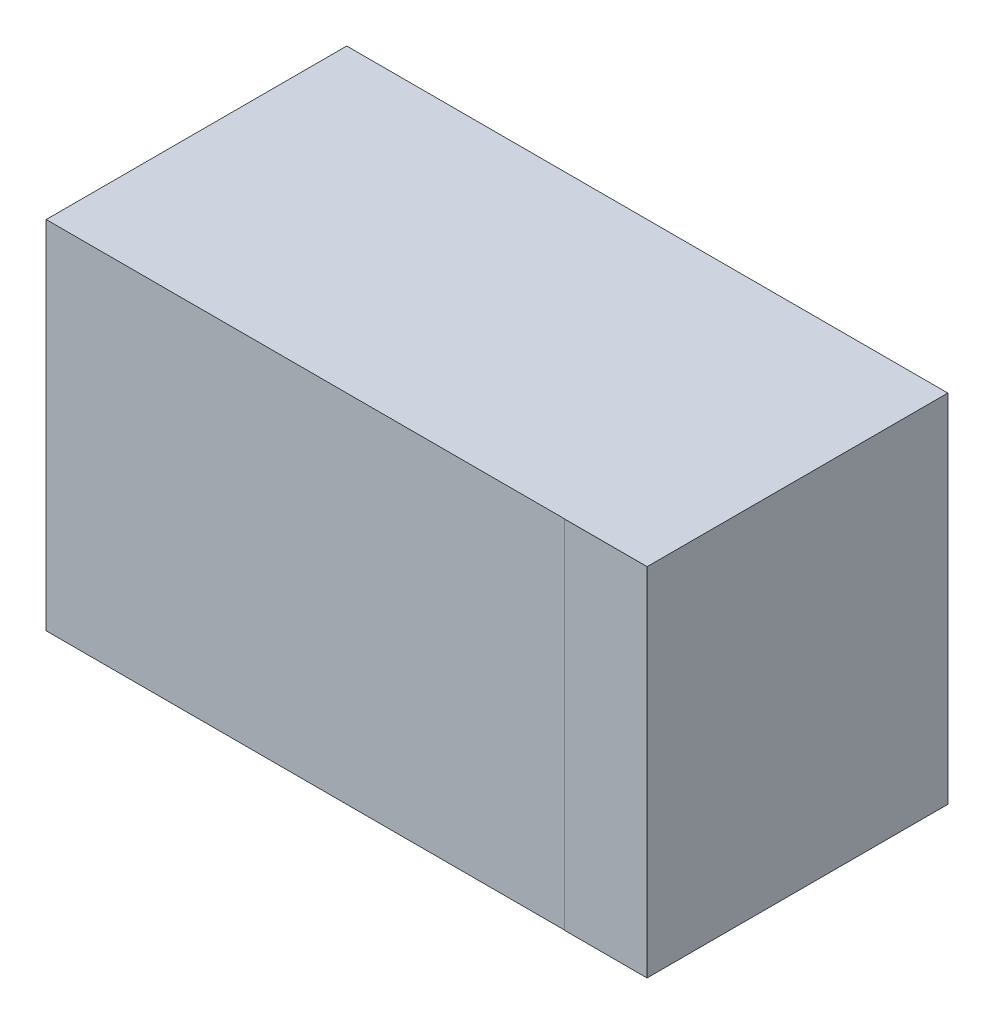
ISO-10303-21;
HEADER;
FILE_DESCRIPTION(('STEP AP214'),'2;1');
FILE_NAME('part.step','',(''),(''),'','','');
FILE_SCHEMA(('AUTOMOTIVE_DESIGN { 1 0 10303 214 1 1 1 1 }'));
ENDSEC;
DATA;
#1=APPLICATION_CONTEXT('core data for automotive mechanical design processes');
#2=APPLICATION_PROTOCOL_DEFINITION('international standard','automotive_design',2000,#1);
#3=PRODUCT_CONTEXT('',#1,'mechanical');
#4=PRODUCT('Part','Part','',(#3));
#5=PRODUCT_RELATED_PRODUCT_CATEGORY('part','',(#4));
#6=PRODUCT_DEFINITION_FORMATION('','',#4);
#7=PRODUCT_DEFINITION_CONTEXT('part definition',#1,'design');
#8=PRODUCT_DEFINITION('design','',#6,#7);
#9=PRODUCT_DEFINITION_SHAPE('','',#8);
#10=(LENGTH_UNIT() NAMED_UNIT(*) SI_UNIT(.MILLI.,.METRE.));
#11=(NAMED_UNIT(*) PLANE_ANGLE_UNIT() SI_UNIT($,.RADIAN.));
#12=(NAMED_UNIT(*) SI_UNIT($,.STERADIAN.) SOLID_ANGLE_UNIT());
#13=UNCERTAINTY_MEASURE_WITH_UNIT(LENGTH_MEASURE(1.E-05),#10,'distance_accuracy_value','');
#14=(GEOMETRIC_REPRESENTATION_CONTEXT(3) GLOBAL_UNCERTAINTY_ASSIGNED_CONTEXT((#13)) GLOBAL_UNIT_ASSIGNED_CONTEXT((#10,
#11,#12)) REPRESENTATION_CONTEXT('',''));
#15=CARTESIAN_POINT('',(0.,0.,0.));
#16=DIRECTION('',(0.,0.,1.));
#17=DIRECTION('',(1.,0.,0.));
#18=AXIS2_PLACEMENT_3D('',#15,#16,#17);
#19=CARTESIAN_POINT('',(-1.34999984,0.80000094,0.));
#20=DIRECTION('',(1.,0.,0.));
#21=DIRECTION('',(0.,-1.,0.));
#22=AXIS2_PLACEMENT_3D('',#19,#20,#21);
#23=PLANE('',#22);
#24=DIRECTION('',(0.,-1.,0.));
#25=VECTOR('',#24,1.);
#26=CARTESIAN_POINT('',(-1.34999984,0.80000094,0.));
#27=LINE('',#26,#25);
#28=CARTESIAN_POINT('',(-1.34999984,0.80000094,0.));
#29=VERTEX_POINT('',#28);
#30=CARTESIAN_POINT('',(-1.34999984,-0.80000094,0.));
#31=VERTEX_POINT('',#30);
#32=EDGE_CURVE('P0_E11',#29,#31,#27,.T.);
#33=ORIENTED_EDGE('',*,*,#32,.T.);
#34=DIRECTION('',(0.,0.,1.));
#35=VECTOR('',#34,1.);
#36=CARTESIAN_POINT('',(-1.34999984,-0.80000094,0.));
#37=LINE('',#36,#35);
#38=CARTESIAN_POINT('',(-1.34999984,-0.80000094,1.34999984));
#39=VERTEX_POINT('',#38);
#40=EDGE_CURVE('P0_E24',#31,#39,#37,.T.);
#41=ORIENTED_EDGE('',*,*,#40,.T.);
#42=DIRECTION('',(0.,-1.,0.));
#43=VECTOR('',#42,1.);
#44=CARTESIAN_POINT('',(-1.34999984,0.80000094,1.34999984));
#45=LINE('',#44,#43);
#46=CARTESIAN_POINT('',(-1.34999984,0.80000094,1.34999984));
#47=VERTEX_POINT('',#46);
#48=EDGE_CURVE('P0_E87',#47,#39,#45,.T.);
#49=ORIENTED_EDGE('',*,*,#48,.F.);
#50=DIRECTION('',(0.,0.,1.));
#51=VECTOR('',#50,1.);
#52=CARTESIAN_POINT('',(-1.34999984,0.80000094,0.));
#53=LINE('',#52,#51);
#54=EDGE_CURVE('P0_E36',#29,#47,#53,.T.);
#55=ORIENTED_EDGE('',*,*,#54,.F.);
#56=EDGE_LOOP('',(#33,#41,#49,#55));
#57=FACE_BOUND('',#56,.T.);
#58=ADVANCED_FACE('P0_F17',(#57),#23,.F.);
#59=CARTESIAN_POINT('',(-1.34999984,-0.80000094,0.));
#60=DIRECTION('',(0.,1.,0.));
#61=DIRECTION('',(1.,0.,0.));
#62=AXIS2_PLACEMENT_3D('',#59,#60,#61);
#63=PLANE('',#62);
#64=DIRECTION('',(1.,0.,0.));
#65=VECTOR('',#64,1.);
#66=CARTESIAN_POINT('',(-1.34999984,-0.80000094,0.));
#67=LINE('',#66,#65);
#68=CARTESIAN_POINT('',(1.34999984,-0.80000094,0.));
#69=VERTEX_POINT('',#68);
#70=EDGE_CURVE('P0_E84',#31,#69,#67,.T.);
#71=ORIENTED_EDGE('',*,*,#70,.T.);
#72=DIRECTION('',(0.,0.,1.));
#73=VECTOR('',#72,1.);
#74=CARTESIAN_POINT('',(1.34999984,-0.80000094,0.));
#75=LINE('',#74,#73);
#76=CARTESIAN_POINT('',(1.34999984,-0.80000094,1.34999984));
#77=VERTEX_POINT('',#76);
#78=EDGE_CURVE('P0_E82',#69,#77,#75,.T.);
#79=ORIENTED_EDGE('',*,*,#78,.T.);
#80=DIRECTION('',(1.,0.,0.));
#81=VECTOR('',#80,1.);
#82=CARTESIAN_POINT('',(-1.34999984,-0.80000094,1.34999984));
#83=LINE('',#82,#81);
#84=EDGE_CURVE('P0_E62',#39,#77,#83,.T.);
#85=ORIENTED_EDGE('',*,*,#84,.F.);
#86=ORIENTED_EDGE('',*,*,#40,.F.);
#87=EDGE_LOOP('',(#71,#79,#85,#86));
#88=FACE_BOUND('',#87,.T.);
#89=ADVANCED_FACE('P0_F89',(#88),#63,.F.);
#90=CARTESIAN_POINT('',(1.34999984,-0.80000094,0.));
#91=DIRECTION('',(-1.,0.,0.));
#92=DIRECTION('',(0.,1.,0.));
#93=AXIS2_PLACEMENT_3D('',#90,#91,#92);
#94=PLANE('',#93);
#95=DIRECTION('',(0.,1.,0.));
#96=VECTOR('',#95,1.);
#97=CARTESIAN_POINT('',(1.34999984,-0.80000094,0.));
#98=LINE('',#97,#96);
#99=CARTESIAN_POINT('',(1.34999984,0.80000094,0.));
#100=VERTEX_POINT('',#99);
#101=EDGE_CURVE('P0_E71',#69,#100,#98,.T.);
#102=ORIENTED_EDGE('',*,*,#101,.T.);
#103=DIRECTION('',(0.,0.,1.));
#104=VECTOR('',#103,1.);
#105=CARTESIAN_POINT('',(1.34999984,0.80000094,0.));
#106=LINE('',#105,#104);
#107=CARTESIAN_POINT('',(1.34999984,0.80000094,1.34999984));
#108=VERTEX_POINT('',#107);
#109=EDGE_CURVE('P0_E65',#100,#108,#106,.T.);
#110=ORIENTED_EDGE('',*,*,#109,.T.);
#111=DIRECTION('',(0.,1.,0.));
#112=VECTOR('',#111,1.);
#113=CARTESIAN_POINT('',(1.34999984,-0.80000094,1.34999984));
#114=LINE('',#113,#112);
#115=EDGE_CURVE('P0_E57',#77,#108,#114,.T.);
#116=ORIENTED_EDGE('',*,*,#115,.F.);
#117=ORIENTED_EDGE('',*,*,#78,.F.);
#118=EDGE_LOOP('',(#102,#110,#116,#117));
#119=FACE_BOUND('',#118,.T.);
#120=ADVANCED_FACE('P0_F69',(#119),#94,.F.);
#121=CARTESIAN_POINT('',(1.34999984,0.80000094,0.));
#122=DIRECTION('',(0.,-1.,0.));
#123=DIRECTION('',(-1.,0.,0.));
#124=AXIS2_PLACEMENT_3D('',#121,#122,#123);
#125=PLANE('',#124);
#126=DIRECTION('',(-1.,0.,0.));
#127=VECTOR('',#126,1.);
#128=CARTESIAN_POINT('',(1.34999984,0.80000094,0.));
#129=LINE('',#128,#127);
#130=EDGE_CURVE('P0_E66',#100,#29,#129,.T.);
#131=ORIENTED_EDGE('',*,*,#130,.T.);
#132=ORIENTED_EDGE('',*,*,#54,.T.);
#133=DIRECTION('',(-1.,0.,0.));
#134=VECTOR('',#133,1.);
#135=CARTESIAN_POINT('',(1.34999984,0.80000094,1.34999984));
#136=LINE('',#135,#134);
#137=EDGE_CURVE('P0_E61',#108,#47,#136,.T.);
#138=ORIENTED_EDGE('',*,*,#137,.F.);
#139=ORIENTED_EDGE('',*,*,#109,.F.);
#140=EDGE_LOOP('',(#131,#132,#138,#139));
#141=FACE_BOUND('',#140,.T.);
#142=ADVANCED_FACE('P0_F76',(#141),#125,.F.);
#143=CARTESIAN_POINT('',(0.,0.,0.));
#144=DIRECTION('',(0.,0.,1.));
#145=DIRECTION('',(0.,-1.,0.));
#146=AXIS2_PLACEMENT_3D('',#143,#144,#145);
#147=PLANE('',#146);
#148=ORIENTED_EDGE('',*,*,#130,.F.);
#149=ORIENTED_EDGE('',*,*,#101,.F.);
#150=ORIENTED_EDGE('',*,*,#70,.F.);
#151=ORIENTED_EDGE('',*,*,#32,.F.);
#152=EDGE_LOOP('',(#148,#149,#150,#151));
#153=FACE_BOUND('',#152,.T.);
#154=ADVANCED_FACE('P0_F91',(#153),#147,.F.);
#155=CARTESIAN_POINT('',(0.,0.,1.34999984));
#156=DIRECTION('',(0.,0.,1.));
#157=DIRECTION('',(0.,-1.,0.));
#158=AXIS2_PLACEMENT_3D('',#155,#156,#157);
#159=PLANE('',#158);
#160=ORIENTED_EDGE('',*,*,#48,.T.);
#161=ORIENTED_EDGE('',*,*,#84,.T.);
#162=ORIENTED_EDGE('',*,*,#115,.T.);
#163=ORIENTED_EDGE('',*,*,#137,.T.);
#164=EDGE_LOOP('',(#160,#161,#162,#163));
#165=FACE_BOUND('',#164,.T.);
#166=ADVANCED_FACE('P0_F59',(#165),#159,.T.);
#167=CLOSED_SHELL('',(#58,#89,#120,#142,#154,#166));
#168=MANIFOLD_SOLID_BREP('P0_B1',#167);
#169=CARTESIAN_POINT('',(1.34999984,-0.80000094,1.34999984));
#170=DIRECTION('',(-1.,0.,0.));
#171=DIRECTION('',(0.,1.,0.));
#172=AXIS2_PLACEMENT_3D('',#169,#170,#171);
#173=PLANE('',#172);
#174=DIRECTION('',(0.,1.,0.));
#175=VECTOR('',#174,1.);
#176=CARTESIAN_POINT('',(1.34999984,-0.80000094,1.34999984));
#177=LINE('',#176,#175);
#178=CARTESIAN_POINT('',(1.34999984,-0.80000094,1.34999984));
#179=VERTEX_POINT('',#178);
#180=CARTESIAN_POINT('',(1.34999984,0.80000094,1.34999984));
#181=VERTEX_POINT('',#180);
#182=EDGE_CURVE('P1_E10',#179,#181,#177,.T.);
#183=ORIENTED_EDGE('',*,*,#182,.T.);
#184=DIRECTION('',(0.,0.,1.));
#185=VECTOR('',#184,1.);
#186=CARTESIAN_POINT('',(1.34999984,0.80000094,1.34999984));
#187=LINE('',#186,#185);
#188=CARTESIAN_POINT('',(1.34999984,0.80000094,1.3510006));
#189=VERTEX_POINT('',#188);
#190=EDGE_CURVE('P1_E23',#181,#189,#187,.T.);
#191=ORIENTED_EDGE('',*,*,#190,.T.);
#192=DIRECTION('',(0.,1.,0.));
#193=VECTOR('',#192,1.);
#194=CARTESIAN_POINT('',(1.34999984,-0.80000094,1.3510006));
#195=LINE('',#194,#193);
#196=CARTESIAN_POINT('',(1.34999984,-0.80000094,1.3510006));
#197=VERTEX_POINT('',#196);
#198=EDGE_CURVE('P1_E86',#197,#189,#195,.T.);
#199=ORIENTED_EDGE('',*,*,#198,.F.);
#200=DIRECTION('',(0.,0.,1.));
#201=VECTOR('',#200,1.);
#202=CARTESIAN_POINT('',(1.34999984,-0.80000094,1.34999984));
#203=LINE('',#202,#201);
#204=EDGE_CURVE('P1_E35',#179,#197,#203,.T.);
#205=ORIENTED_EDGE('',*,*,#204,.F.);
#206=EDGE_LOOP('',(#183,#191,#199,#205));
#207=FACE_BOUND('',#206,.T.);
#208=ADVANCED_FACE('P1_F16',(#207),#173,.F.);
#209=CARTESIAN_POINT('',(1.34999984,0.80000094,1.34999984));
#210=DIRECTION('',(0.,-1.,0.));
#211=DIRECTION('',(-1.,0.,0.));
#212=AXIS2_PLACEMENT_3D('',#209,#210,#211);
#213=PLANE('',#212);
#214=DIRECTION('',(-1.,0.,0.));
#215=VECTOR('',#214,1.);
#216=CARTESIAN_POINT('',(1.34999984,0.80000094,1.34999984));
#217=LINE('',#216,#215);
#218=CARTESIAN_POINT('',(0.98000058,0.80000094,1.34999984));
#219=VERTEX_POINT('',#218);
#220=EDGE_CURVE('P1_E83',#181,#219,#217,.T.);
#221=ORIENTED_EDGE('',*,*,#220,.T.);
#222=DIRECTION('',(0.,0.,1.));
#223=VECTOR('',#222,1.);
#224=CARTESIAN_POINT('',(0.98000058,0.80000094,1.34999984));
#225=LINE('',#224,#223);
#226=CARTESIAN_POINT('',(0.98000058,0.80000094,1.3510006));
#227=VERTEX_POINT('',#226);
#228=EDGE_CURVE('P1_E81',#219,#227,#225,.T.);
#229=ORIENTED_EDGE('',*,*,#228,.T.);
#230=DIRECTION('',(-1.,0.,0.));
#231=VECTOR('',#230,1.);
#232=CARTESIAN_POINT('',(1.34999984,0.80000094,1.3510006));
#233=LINE('',#232,#231);
#234=EDGE_CURVE('P1_E61',#189,#227,#233,.T.);
#235=ORIENTED_EDGE('',*,*,#234,.F.);
#236=ORIENTED_EDGE('',*,*,#190,.F.);
#237=EDGE_LOOP('',(#221,#229,#235,#236));
#238=FACE_BOUND('',#237,.T.);
#239=ADVANCED_FACE('P1_F88',(#238),#213,.F.);
#240=CARTESIAN_POINT('',(0.98000058,0.80000094,1.34999984));
#241=DIRECTION('',(1.,0.,0.));
#242=DIRECTION('',(0.,-1.,0.));
#243=AXIS2_PLACEMENT_3D('',#240,#241,#242);
#244=PLANE('',#243);
#245=DIRECTION('',(0.,-1.,0.));
#246=VECTOR('',#245,1.);
#247=CARTESIAN_POINT('',(0.98000058,0.80000094,1.34999984));
#248=LINE('',#247,#246);
#249=CARTESIAN_POINT('',(0.98000058,-0.80000094,1.34999984));
#250=VERTEX_POINT('',#249);
#251=EDGE_CURVE('P1_E70',#219,#250,#248,.T.);
#252=ORIENTED_EDGE('',*,*,#251,.T.);
#253=DIRECTION('',(0.,0.,1.));
#254=VECTOR('',#253,1.);
#255=CARTESIAN_POINT('',(0.98000058,-0.80000094,1.34999984));
#256=LINE('',#255,#254);
#257=CARTESIAN_POINT('',(0.98000058,-0.80000094,1.3510006));
#258=VERTEX_POINT('',#257);
#259=EDGE_CURVE('P1_E64',#250,#258,#256,.T.);
#260=ORIENTED_EDGE('',*,*,#259,.T.);
#261=DIRECTION('',(0.,-1.,0.));
#262=VECTOR('',#261,1.);
#263=CARTESIAN_POINT('',(0.98000058,0.80000094,1.3510006));
#264=LINE('',#263,#262);
#265=EDGE_CURVE('P1_E56',#227,#258,#264,.T.);
#266=ORIENTED_EDGE('',*,*,#265,.F.);
#267=ORIENTED_EDGE('',*,*,#228,.F.);
#268=EDGE_LOOP('',(#252,#260,#266,#267));
#269=FACE_BOUND('',#268,.T.);
#270=ADVANCED_FACE('P1_F68',(#269),#244,.F.);
#271=CARTESIAN_POINT('',(0.98000058,-0.80000094,1.34999984));
#272=DIRECTION('',(0.,1.,0.));
#273=DIRECTION('',(1.,0.,0.));
#274=AXIS2_PLACEMENT_3D('',#271,#272,#273);
#275=PLANE('',#274);
#276=DIRECTION('',(1.,0.,0.));
#277=VECTOR('',#276,1.);
#278=CARTESIAN_POINT('',(0.98000058,-0.80000094,1.34999984));
#279=LINE('',#278,#277);
#280=EDGE_CURVE('P1_E65',#250,#179,#279,.T.);
#281=ORIENTED_EDGE('',*,*,#280,.T.);
#282=ORIENTED_EDGE('',*,*,#204,.T.);
#283=DIRECTION('',(1.,0.,0.));
#284=VECTOR('',#283,1.);
#285=CARTESIAN_POINT('',(0.98000058,-0.80000094,1.3510006));
#286=LINE('',#285,#284);
#287=EDGE_CURVE('P1_E60',#258,#197,#286,.T.);
#288=ORIENTED_EDGE('',*,*,#287,.F.);
#289=ORIENTED_EDGE('',*,*,#259,.F.);
#290=EDGE_LOOP('',(#281,#282,#288,#289));
#291=FACE_BOUND('',#290,.T.);
#292=ADVANCED_FACE('P1_F75',(#291),#275,.F.);
#293=CARTESIAN_POINT('',(1.16500021,0.,1.34999984));
#294=DIRECTION('',(0.,0.,1.));
#295=DIRECTION('',(0.,-1.,0.));
#296=AXIS2_PLACEMENT_3D('',#293,#294,#295);
#297=PLANE('',#296);
#298=ORIENTED_EDGE('',*,*,#280,.F.);
#299=ORIENTED_EDGE('',*,*,#251,.F.);
#300=ORIENTED_EDGE('',*,*,#220,.F.);
#301=ORIENTED_EDGE('',*,*,#182,.F.);
#302=EDGE_LOOP('',(#298,#299,#300,#301));
#303=FACE_BOUND('',#302,.T.);
#304=ADVANCED_FACE('P1_F90',(#303),#297,.F.);
#305=CARTESIAN_POINT('',(1.16500021,0.,1.3510006));
#306=DIRECTION('',(0.,0.,1.));
#307=DIRECTION('',(0.,-1.,0.));
#308=AXIS2_PLACEMENT_3D('',#305,#306,#307);
#309=PLANE('',#308);
#310=ORIENTED_EDGE('',*,*,#198,.T.);
#311=ORIENTED_EDGE('',*,*,#234,.T.);
#312=ORIENTED_EDGE('',*,*,#265,.T.);
#313=ORIENTED_EDGE('',*,*,#287,.T.);
#314=EDGE_LOOP('',(#310,#311,#312,#313));
#315=FACE_BOUND('',#314,.T.);
#316=ADVANCED_FACE('P1_F58',(#315),#309,.T.);
#317=CLOSED_SHELL('',(#208,#239,#270,#292,#304,#316));
#318=MANIFOLD_SOLID_BREP('P1_B1',#317);
#319=ADVANCED_BREP_SHAPE_REPRESENTATION('',(#18,#168,#318),#14);
#320=SHAPE_DEFINITION_REPRESENTATION(#9,#319);
ENDSEC;
END-ISO-10303-21;
